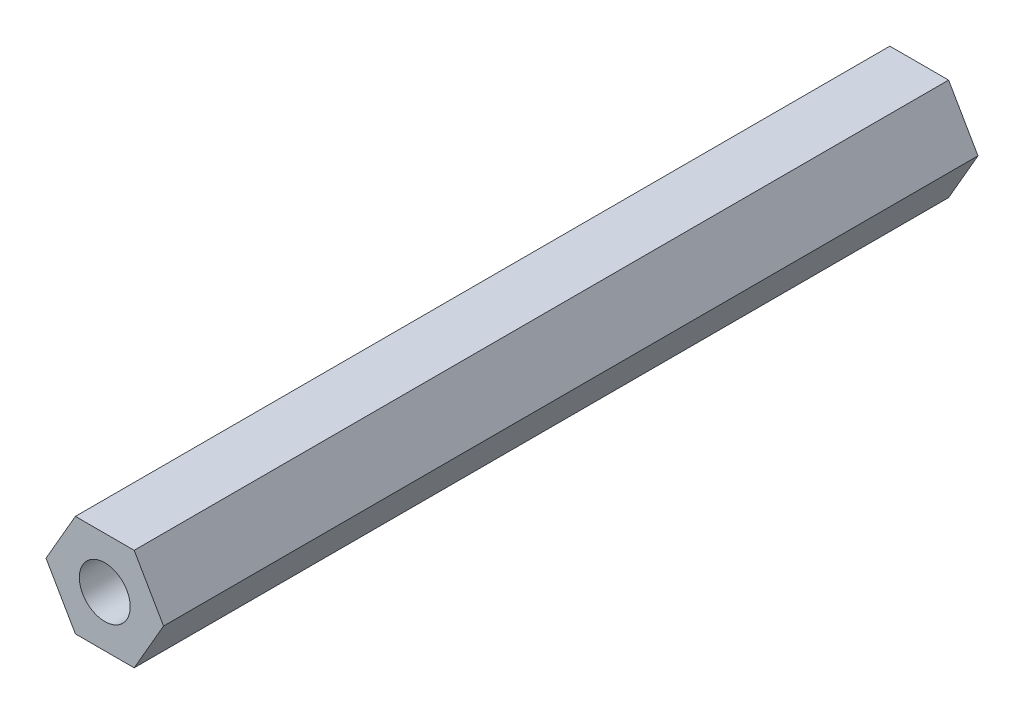
ISO-10303-21;
HEADER;
FILE_DESCRIPTION(('STEP AP214'),'2;1');
FILE_NAME('part.step','',(''),(''),'','','');
FILE_SCHEMA(('AUTOMOTIVE_DESIGN { 1 0 10303 214 1 1 1 1 }'));
ENDSEC;
DATA;
#1=APPLICATION_CONTEXT('core data for automotive mechanical design processes');
#2=APPLICATION_PROTOCOL_DEFINITION('international standard','automotive_design',2000,#1);
#3=PRODUCT_CONTEXT('',#1,'mechanical');
#4=PRODUCT('Part','Part','',(#3));
#5=PRODUCT_RELATED_PRODUCT_CATEGORY('part','',(#4));
#6=PRODUCT_DEFINITION_FORMATION('','',#4);
#7=PRODUCT_DEFINITION_CONTEXT('part definition',#1,'design');
#8=PRODUCT_DEFINITION('design','',#6,#7);
#9=PRODUCT_DEFINITION_SHAPE('','',#8);
#10=(LENGTH_UNIT() NAMED_UNIT(*) SI_UNIT(.MILLI.,.METRE.));
#11=(NAMED_UNIT(*) PLANE_ANGLE_UNIT() SI_UNIT($,.RADIAN.));
#12=(NAMED_UNIT(*) SI_UNIT($,.STERADIAN.) SOLID_ANGLE_UNIT());
#13=UNCERTAINTY_MEASURE_WITH_UNIT(LENGTH_MEASURE(1.E-05),#10,'distance_accuracy_value','');
#14=(GEOMETRIC_REPRESENTATION_CONTEXT(3) GLOBAL_UNCERTAINTY_ASSIGNED_CONTEXT((#13)) GLOBAL_UNIT_ASSIGNED_CONTEXT((#10,
#11,#12)) REPRESENTATION_CONTEXT('',''));
#15=CARTESIAN_POINT('',(0.,0.,0.));
#16=DIRECTION('',(0.,0.,1.));
#17=DIRECTION('',(1.,0.,0.));
#18=AXIS2_PLACEMENT_3D('',#15,#16,#17);
#19=CARTESIAN_POINT('',(0.,0.,50.8));
#20=DIRECTION('',(0.,0.,1.));
#21=DIRECTION('',(1.,0.,0.));
#22=AXIS2_PLACEMENT_3D('',#19,#20,#21);
#23=PLANE('',#22);
#24=DIRECTION('',(-0.5,0.866025403784439,0.));
#25=VECTOR('',#24,1.);
#26=CARTESIAN_POINT('',(7.33234841870825,0.,50.8));
#27=LINE('',#26,#25);
#28=CARTESIAN_POINT('',(7.33234841870825,0.,50.8));
#29=VERTEX_POINT('',#28);
#30=CARTESIAN_POINT('',(3.66617420935413,6.35,50.8));
#31=VERTEX_POINT('',#30);
#32=EDGE_CURVE('E162',#29,#31,#27,.T.);
#33=ORIENTED_EDGE('',*,*,#32,.T.);
#34=DIRECTION('',(-1.,0.,0.));
#35=VECTOR('',#34,1.);
#36=CARTESIAN_POINT('',(3.66617420935413,6.35,50.8));
#37=LINE('',#36,#35);
#38=CARTESIAN_POINT('',(-3.66617420935412,6.35,50.8));
#39=VERTEX_POINT('',#38);
#40=EDGE_CURVE('E109',#31,#39,#37,.T.);
#41=ORIENTED_EDGE('',*,*,#40,.T.);
#42=DIRECTION('',(-0.5,-0.866025403784438,0.));
#43=VECTOR('',#42,1.);
#44=CARTESIAN_POINT('',(-3.66617420935412,6.35,50.8));
#45=LINE('',#44,#43);
#46=CARTESIAN_POINT('',(-7.33234841870825,0.,50.8));
#47=VERTEX_POINT('',#46);
#48=EDGE_CURVE('E123',#39,#47,#45,.T.);
#49=ORIENTED_EDGE('',*,*,#48,.T.);
#50=DIRECTION('',(0.5,-0.866025403784439,0.));
#51=VECTOR('',#50,1.);
#52=CARTESIAN_POINT('',(-7.33234841870825,0.,50.8));
#53=LINE('',#52,#51);
#54=CARTESIAN_POINT('',(-3.66617420935413,-6.35,50.8));
#55=VERTEX_POINT('',#54);
#56=EDGE_CURVE('E117',#47,#55,#53,.T.);
#57=ORIENTED_EDGE('',*,*,#56,.T.);
#58=DIRECTION('',(1.,0.,0.));
#59=VECTOR('',#58,1.);
#60=CARTESIAN_POINT('',(-3.66617420935413,-6.35,50.8));
#61=LINE('',#60,#59);
#62=CARTESIAN_POINT('',(3.66617420935412,-6.35,50.8));
#63=VERTEX_POINT('',#62);
#64=EDGE_CURVE('E121',#55,#63,#61,.T.);
#65=ORIENTED_EDGE('',*,*,#64,.T.);
#66=DIRECTION('',(0.5,0.866025403784438,0.));
#67=VECTOR('',#66,1.);
#68=CARTESIAN_POINT('',(3.66617420935412,-6.35,50.8));
#69=LINE('',#68,#67);
#70=EDGE_CURVE('E64',#63,#29,#69,.T.);
#71=ORIENTED_EDGE('',*,*,#70,.T.);
#72=EDGE_LOOP('',(#33,#41,#49,#57,#65,#71));
#73=FACE_BOUND('',#72,.T.);
#74=CARTESIAN_POINT('',(0.,0.,50.8));
#75=DIRECTION('',(0.,0.,1.));
#76=DIRECTION('',(1.,0.,0.));
#77=AXIS2_PLACEMENT_3D('',#74,#75,#76);
#78=CIRCLE('',#77,3.175);
#79=CARTESIAN_POINT('',(3.175,0.,50.8));
#80=VERTEX_POINT('',#79);
#81=EDGE_CURVE('E150',#80,#80,#78,.T.);
#82=ORIENTED_EDGE('',*,*,#81,.F.);
#83=EDGE_LOOP('',(#82));
#84=FACE_BOUND('',#83,.T.);
#85=ADVANCED_FACE('F43',(#73,#84),#23,.T.);
#86=CARTESIAN_POINT('',(0.,0.,-50.8));
#87=DIRECTION('',(0.,0.,1.));
#88=DIRECTION('',(1.,0.,0.));
#89=AXIS2_PLACEMENT_3D('',#86,#87,#88);
#90=PLANE('',#89);
#91=DIRECTION('',(-0.5,0.866025403784439,0.));
#92=VECTOR('',#91,1.);
#93=CARTESIAN_POINT('',(7.33234841870825,0.,-50.8));
#94=LINE('',#93,#92);
#95=CARTESIAN_POINT('',(7.33234841870825,0.,-50.8));
#96=VERTEX_POINT('',#95);
#97=CARTESIAN_POINT('',(3.66617420935413,6.35,-50.8));
#98=VERTEX_POINT('',#97);
#99=EDGE_CURVE('E145',#96,#98,#94,.T.);
#100=ORIENTED_EDGE('',*,*,#99,.F.);
#101=DIRECTION('',(0.5,0.866025403784438,0.));
#102=VECTOR('',#101,1.);
#103=CARTESIAN_POINT('',(3.66617420935412,-6.35,-50.8));
#104=LINE('',#103,#102);
#105=CARTESIAN_POINT('',(3.66617420935412,-6.35,-50.8));
#106=VERTEX_POINT('',#105);
#107=EDGE_CURVE('E99',#106,#96,#104,.T.);
#108=ORIENTED_EDGE('',*,*,#107,.F.);
#109=DIRECTION('',(1.,0.,0.));
#110=VECTOR('',#109,1.);
#111=CARTESIAN_POINT('',(-3.66617420935413,-6.35,-50.8));
#112=LINE('',#111,#110);
#113=CARTESIAN_POINT('',(-3.66617420935413,-6.35,-50.8));
#114=VERTEX_POINT('',#113);
#115=EDGE_CURVE('E93',#114,#106,#112,.T.);
#116=ORIENTED_EDGE('',*,*,#115,.F.);
#117=DIRECTION('',(0.5,-0.866025403784439,0.));
#118=VECTOR('',#117,1.);
#119=CARTESIAN_POINT('',(-7.33234841870825,0.,-50.8));
#120=LINE('',#119,#118);
#121=CARTESIAN_POINT('',(-7.33234841870825,0.,-50.8));
#122=VERTEX_POINT('',#121);
#123=EDGE_CURVE('E132',#122,#114,#120,.T.);
#124=ORIENTED_EDGE('',*,*,#123,.F.);
#125=DIRECTION('',(-0.5,-0.866025403784438,0.));
#126=VECTOR('',#125,1.);
#127=CARTESIAN_POINT('',(-3.66617420935412,6.35,-50.8));
#128=LINE('',#127,#126);
#129=CARTESIAN_POINT('',(-3.66617420935412,6.35,-50.8));
#130=VERTEX_POINT('',#129);
#131=EDGE_CURVE('E153',#130,#122,#128,.T.);
#132=ORIENTED_EDGE('',*,*,#131,.F.);
#133=DIRECTION('',(-1.,0.,0.));
#134=VECTOR('',#133,1.);
#135=CARTESIAN_POINT('',(3.66617420935413,6.35,-50.8));
#136=LINE('',#135,#134);
#137=EDGE_CURVE('E149',#98,#130,#136,.T.);
#138=ORIENTED_EDGE('',*,*,#137,.F.);
#139=EDGE_LOOP('',(#100,#108,#116,#124,#132,#138));
#140=FACE_BOUND('',#139,.T.);
#141=CARTESIAN_POINT('',(0.,0.,-50.8));
#142=DIRECTION('',(0.,0.,1.));
#143=DIRECTION('',(1.,0.,0.));
#144=AXIS2_PLACEMENT_3D('',#141,#142,#143);
#145=CIRCLE('',#144,3.175);
#146=CARTESIAN_POINT('',(3.175,0.,-50.8));
#147=VERTEX_POINT('',#146);
#148=EDGE_CURVE('E267',#147,#147,#145,.T.);
#149=ORIENTED_EDGE('',*,*,#148,.T.);
#150=EDGE_LOOP('',(#149));
#151=FACE_BOUND('',#150,.T.);
#152=ADVANCED_FACE('F175',(#140,#151),#90,.F.);
#153=CARTESIAN_POINT('',(7.33234841870825,0.,50.8));
#154=DIRECTION('',(-0.866025403784439,-0.5,0.));
#155=DIRECTION('',(0.5,-0.866025403784439,0.));
#156=AXIS2_PLACEMENT_3D('',#153,#154,#155);
#157=PLANE('',#156);
#158=ORIENTED_EDGE('',*,*,#99,.T.);
#159=DIRECTION('',(0.,0.,-1.));
#160=VECTOR('',#159,1.);
#161=CARTESIAN_POINT('',(3.66617420935413,6.35,50.8));
#162=LINE('',#161,#160);
#163=EDGE_CURVE('E11',#31,#98,#162,.T.);
#164=ORIENTED_EDGE('',*,*,#163,.F.);
#165=ORIENTED_EDGE('',*,*,#32,.F.);
#166=DIRECTION('',(0.,0.,-1.));
#167=VECTOR('',#166,1.);
#168=CARTESIAN_POINT('',(7.33234841870825,0.,50.8));
#169=LINE('',#168,#167);
#170=EDGE_CURVE('E141',#29,#96,#169,.T.);
#171=ORIENTED_EDGE('',*,*,#170,.T.);
#172=EDGE_LOOP('',(#158,#164,#165,#171));
#173=FACE_BOUND('',#172,.T.);
#174=ADVANCED_FACE('F45',(#173),#157,.F.);
#175=CARTESIAN_POINT('',(3.66617420935413,6.35,50.8));
#176=DIRECTION('',(0.,-1.,0.));
#177=DIRECTION('',(1.,0.,0.));
#178=AXIS2_PLACEMENT_3D('',#175,#176,#177);
#179=PLANE('',#178);
#180=ORIENTED_EDGE('',*,*,#137,.T.);
#181=DIRECTION('',(0.,0.,-1.));
#182=VECTOR('',#181,1.);
#183=CARTESIAN_POINT('',(-3.66617420935412,6.35,50.8));
#184=LINE('',#183,#182);
#185=EDGE_CURVE('E53',#39,#130,#184,.T.);
#186=ORIENTED_EDGE('',*,*,#185,.F.);
#187=ORIENTED_EDGE('',*,*,#40,.F.);
#188=ORIENTED_EDGE('',*,*,#163,.T.);
#189=EDGE_LOOP('',(#180,#186,#187,#188));
#190=FACE_BOUND('',#189,.T.);
#191=ADVANCED_FACE('F200',(#190),#179,.F.);
#192=CARTESIAN_POINT('',(-3.66617420935412,6.35,50.8));
#193=DIRECTION('',(0.866025403784438,-0.5,0.));
#194=DIRECTION('',(0.5,0.866025403784439,0.));
#195=AXIS2_PLACEMENT_3D('',#192,#193,#194);
#196=PLANE('',#195);
#197=ORIENTED_EDGE('',*,*,#131,.T.);
#198=DIRECTION('',(0.,0.,-1.));
#199=VECTOR('',#198,1.);
#200=CARTESIAN_POINT('',(-7.33234841870825,0.,50.8));
#201=LINE('',#200,#199);
#202=EDGE_CURVE('E134',#47,#122,#201,.T.);
#203=ORIENTED_EDGE('',*,*,#202,.F.);
#204=ORIENTED_EDGE('',*,*,#48,.F.);
#205=ORIENTED_EDGE('',*,*,#185,.T.);
#206=EDGE_LOOP('',(#197,#203,#204,#205));
#207=FACE_BOUND('',#206,.T.);
#208=ADVANCED_FACE('F172',(#207),#196,.F.);
#209=CARTESIAN_POINT('',(-7.33234841870825,0.,50.8));
#210=DIRECTION('',(0.866025403784439,0.5,0.));
#211=DIRECTION('',(-0.5,0.866025403784439,0.));
#212=AXIS2_PLACEMENT_3D('',#209,#210,#211);
#213=PLANE('',#212);
#214=ORIENTED_EDGE('',*,*,#123,.T.);
#215=DIRECTION('',(0.,0.,-1.));
#216=VECTOR('',#215,1.);
#217=CARTESIAN_POINT('',(-3.66617420935413,-6.35,50.8));
#218=LINE('',#217,#216);
#219=EDGE_CURVE('E129',#55,#114,#218,.T.);
#220=ORIENTED_EDGE('',*,*,#219,.F.);
#221=ORIENTED_EDGE('',*,*,#56,.F.);
#222=ORIENTED_EDGE('',*,*,#202,.T.);
#223=EDGE_LOOP('',(#214,#220,#221,#222));
#224=FACE_BOUND('',#223,.T.);
#225=ADVANCED_FACE('F130',(#224),#213,.F.);
#226=CARTESIAN_POINT('',(-3.66617420935413,-6.35,50.8));
#227=DIRECTION('',(0.,1.,0.));
#228=DIRECTION('',(-1.,0.,0.));
#229=AXIS2_PLACEMENT_3D('',#226,#227,#228);
#230=PLANE('',#229);
#231=ORIENTED_EDGE('',*,*,#115,.T.);
#232=DIRECTION('',(0.,0.,-1.));
#233=VECTOR('',#232,1.);
#234=CARTESIAN_POINT('',(3.66617420935412,-6.35,50.8));
#235=LINE('',#234,#233);
#236=EDGE_CURVE('E135',#63,#106,#235,.T.);
#237=ORIENTED_EDGE('',*,*,#236,.F.);
#238=ORIENTED_EDGE('',*,*,#64,.F.);
#239=ORIENTED_EDGE('',*,*,#219,.T.);
#240=EDGE_LOOP('',(#231,#237,#238,#239));
#241=FACE_BOUND('',#240,.T.);
#242=ADVANCED_FACE('F137',(#241),#230,.F.);
#243=CARTESIAN_POINT('',(3.66617420935412,-6.35,50.8));
#244=DIRECTION('',(-0.866025403784438,0.5,0.));
#245=DIRECTION('',(-0.5,-0.866025403784438,0.));
#246=AXIS2_PLACEMENT_3D('',#243,#244,#245);
#247=PLANE('',#246);
#248=ORIENTED_EDGE('',*,*,#107,.T.);
#249=ORIENTED_EDGE('',*,*,#170,.F.);
#250=ORIENTED_EDGE('',*,*,#70,.F.);
#251=ORIENTED_EDGE('',*,*,#236,.T.);
#252=EDGE_LOOP('',(#248,#249,#250,#251));
#253=FACE_BOUND('',#252,.T.);
#254=ADVANCED_FACE('F180',(#253),#247,.F.);
#255=CARTESIAN_POINT('',(0.,0.,50.8));
#256=DIRECTION('',(0.,0.,-1.));
#257=DIRECTION('',(-1.,0.,0.));
#258=AXIS2_PLACEMENT_3D('',#255,#256,#257);
#259=CYLINDRICAL_SURFACE('',#258,3.175);
#260=ORIENTED_EDGE('',*,*,#81,.T.);
#261=EDGE_LOOP('',(#260));
#262=FACE_BOUND('',#261,.T.);
#263=ORIENTED_EDGE('',*,*,#148,.F.);
#264=EDGE_LOOP('',(#263));
#265=FACE_BOUND('',#264,.T.);
#266=ADVANCED_FACE('F182',(#262,#265),#259,.F.);
#267=CLOSED_SHELL('',(#85,#152,#174,#191,#208,#225,#242,#254,#266));
#268=MANIFOLD_SOLID_BREP('B2',#267);
#269=ADVANCED_BREP_SHAPE_REPRESENTATION('',(#18,#268),#14);
#270=SHAPE_DEFINITION_REPRESENTATION(#9,#269);
ENDSEC;
END-ISO-10303-21;
